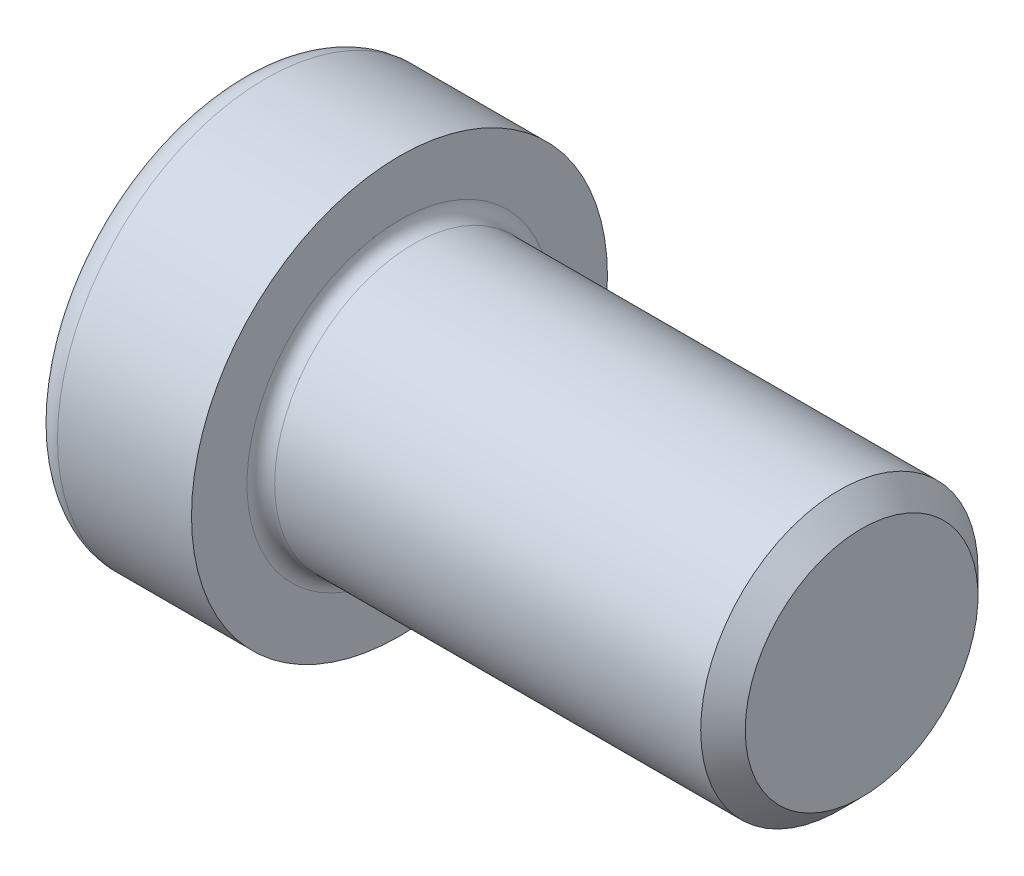
ISO-10303-21;
HEADER;
FILE_DESCRIPTION(('STEP AP214'),'2;1');
FILE_NAME('part.step','',(''),(''),'','','');
FILE_SCHEMA(('AUTOMOTIVE_DESIGN { 1 0 10303 214 1 1 1 1 }'));
ENDSEC;
DATA;
#1=APPLICATION_CONTEXT('core data for automotive mechanical design processes');
#2=APPLICATION_PROTOCOL_DEFINITION('international standard','automotive_design',2000,#1);
#3=PRODUCT_CONTEXT('',#1,'mechanical');
#4=PRODUCT('Part','Part','',(#3));
#5=PRODUCT_RELATED_PRODUCT_CATEGORY('part','',(#4));
#6=PRODUCT_DEFINITION_FORMATION('','',#4);
#7=PRODUCT_DEFINITION_CONTEXT('part definition',#1,'design');
#8=PRODUCT_DEFINITION('design','',#6,#7);
#9=PRODUCT_DEFINITION_SHAPE('','',#8);
#10=(LENGTH_UNIT() NAMED_UNIT(*) SI_UNIT(.MILLI.,.METRE.));
#11=(NAMED_UNIT(*) PLANE_ANGLE_UNIT() SI_UNIT($,.RADIAN.));
#12=(NAMED_UNIT(*) SI_UNIT($,.STERADIAN.) SOLID_ANGLE_UNIT());
#13=UNCERTAINTY_MEASURE_WITH_UNIT(LENGTH_MEASURE(1.E-05),#10,'distance_accuracy_value','');
#14=(GEOMETRIC_REPRESENTATION_CONTEXT(3) GLOBAL_UNCERTAINTY_ASSIGNED_CONTEXT((#13)) GLOBAL_UNIT_ASSIGNED_CONTEXT((#10,
#11,#12)) REPRESENTATION_CONTEXT('',''));
#15=CARTESIAN_POINT('',(0.,0.,0.));
#16=DIRECTION('',(0.,0.,1.));
#17=DIRECTION('',(1.,0.,0.));
#18=AXIS2_PLACEMENT_3D('',#15,#16,#17);
#19=CARTESIAN_POINT('',(0.,0.,0.));
#20=DIRECTION('',(-1.,0.,0.));
#21=DIRECTION('',(0.,0.,1.));
#22=AXIS2_PLACEMENT_3D('',#19,#20,#21);
#23=PLANE('',#22);
#24=DIRECTION('',(0.,-0.499999999999998,0.86602540378444));
#25=VECTOR('',#24,1.);
#26=CARTESIAN_POINT('',(0.,4.61880215351701,0.));
#27=LINE('',#26,#25);
#28=CARTESIAN_POINT('',(0.,4.61880215351701,0.));
#29=VERTEX_POINT('',#28);
#30=CARTESIAN_POINT('',(0.,2.30940107675852,3.99999999999999));
#31=VERTEX_POINT('',#30);
#32=EDGE_CURVE('E294',#29,#31,#27,.T.);
#33=ORIENTED_EDGE('',*,*,#32,.T.);
#34=DIRECTION('',(0.,1.,0.));
#35=VECTOR('',#34,1.);
#36=CARTESIAN_POINT('',(0.,-2.30940107675849,4.));
#37=LINE('',#36,#35);
#38=CARTESIAN_POINT('',(0.,-2.30940107675849,4.));
#39=VERTEX_POINT('',#38);
#40=EDGE_CURVE('E148',#39,#31,#37,.T.);
#41=ORIENTED_EDGE('',*,*,#40,.F.);
#42=DIRECTION('',(0.,-0.500000000000001,-0.866025403784438));
#43=VECTOR('',#42,1.);
#44=CARTESIAN_POINT('',(0.,-2.30940107675849,4.));
#45=LINE('',#44,#43);
#46=CARTESIAN_POINT('',(0.,-4.618802153517,0.));
#47=VERTEX_POINT('',#46);
#48=EDGE_CURVE('E299',#39,#47,#45,.T.);
#49=ORIENTED_EDGE('',*,*,#48,.T.);
#50=DIRECTION('',(0.,0.499999999999998,-0.86602540378444));
#51=VECTOR('',#50,1.);
#52=CARTESIAN_POINT('',(0.,-4.618802153517,0.));
#53=LINE('',#52,#51);
#54=CARTESIAN_POINT('',(0.,-2.3094010767585,-4.));
#55=VERTEX_POINT('',#54);
#56=EDGE_CURVE('E303',#47,#55,#53,.T.);
#57=ORIENTED_EDGE('',*,*,#56,.T.);
#58=DIRECTION('',(0.,-1.,0.));
#59=VECTOR('',#58,1.);
#60=CARTESIAN_POINT('',(0.,2.3094010767585,-4.00000000000001));
#61=LINE('',#60,#59);
#62=CARTESIAN_POINT('',(0.,2.3094010767585,-4.00000000000001));
#63=VERTEX_POINT('',#62);
#64=EDGE_CURVE('E307',#63,#55,#61,.T.);
#65=ORIENTED_EDGE('',*,*,#64,.F.);
#66=DIRECTION('',(0.,-0.500000000000001,-0.866025403784438));
#67=VECTOR('',#66,1.);
#68=CARTESIAN_POINT('',(0.,4.61880215351701,0.));
#69=LINE('',#68,#67);
#70=EDGE_CURVE('E143',#29,#63,#69,.T.);
#71=ORIENTED_EDGE('',*,*,#70,.F.);
#72=EDGE_LOOP('',(#33,#41,#49,#57,#65,#71));
#73=FACE_BOUND('',#72,.T.);
#74=CARTESIAN_POINT('',(0.,0.,0.));
#75=DIRECTION('',(-1.,0.,0.));
#76=DIRECTION('',(0.,0.,1.));
#77=AXIS2_PLACEMENT_3D('',#74,#75,#76);
#78=CIRCLE('',#77,7.8);
#79=CARTESIAN_POINT('',(0.,0.,7.8));
#80=VERTEX_POINT('',#79);
#81=EDGE_CURVE('E58',#80,#80,#78,.T.);
#82=ORIENTED_EDGE('',*,*,#81,.T.);
#83=EDGE_LOOP('',(#82));
#84=FACE_BOUND('',#83,.T.);
#85=ADVANCED_FACE('F49',(#73,#84),#23,.T.);
#86=CARTESIAN_POINT('',(-31.75,0.,0.));
#87=DIRECTION('',(-1.,0.,0.));
#88=DIRECTION('',(0.,0.,1.));
#89=AXIS2_PLACEMENT_3D('',#86,#87,#88);
#90=CYLINDRICAL_SURFACE('',#89,9.);
#91=CARTESIAN_POINT('',(1.2,0.,0.));
#92=DIRECTION('',(-1.,0.,0.));
#93=DIRECTION('',(0.,0.,1.));
#94=AXIS2_PLACEMENT_3D('',#91,#92,#93);
#95=CIRCLE('',#94,9.);
#96=CARTESIAN_POINT('',(1.2,0.,9.));
#97=VERTEX_POINT('',#96);
#98=EDGE_CURVE('E11',#97,#97,#95,.F.);
#99=ORIENTED_EDGE('',*,*,#98,.T.);
#100=EDGE_LOOP('',(#99));
#101=FACE_BOUND('',#100,.T.);
#102=CARTESIAN_POINT('',(7.,0.,0.));
#103=DIRECTION('',(-1.,0.,0.));
#104=DIRECTION('',(0.,0.,1.));
#105=AXIS2_PLACEMENT_3D('',#102,#103,#104);
#106=CIRCLE('',#105,9.);
#107=CARTESIAN_POINT('',(7.,0.,9.));
#108=VERTEX_POINT('',#107);
#109=EDGE_CURVE('E173',#108,#108,#106,.T.);
#110=ORIENTED_EDGE('',*,*,#109,.T.);
#111=EDGE_LOOP('',(#110));
#112=FACE_BOUND('',#111,.T.);
#113=ADVANCED_FACE('F203',(#101,#112),#90,.T.);
#114=CARTESIAN_POINT('',(7.,9.,0.));
#115=DIRECTION('',(1.,0.,0.));
#116=DIRECTION('',(0.,0.,-1.));
#117=AXIS2_PLACEMENT_3D('',#114,#115,#116);
#118=PLANE('',#117);
#119=CARTESIAN_POINT('',(7.,0.,0.));
#120=DIRECTION('',(1.,0.,0.));
#121=DIRECTION('',(0.,0.,-1.));
#122=AXIS2_PLACEMENT_3D('',#119,#120,#121);
#123=CIRCLE('',#122,6.6);
#124=CARTESIAN_POINT('',(7.,0.,-6.6));
#125=VERTEX_POINT('',#124);
#126=EDGE_CURVE('E177',#125,#125,#123,.F.);
#127=ORIENTED_EDGE('',*,*,#126,.T.);
#128=EDGE_LOOP('',(#127));
#129=FACE_BOUND('',#128,.T.);
#130=ORIENTED_EDGE('',*,*,#109,.F.);
#131=EDGE_LOOP('',(#130));
#132=FACE_BOUND('',#131,.T.);
#133=ADVANCED_FACE('F208',(#129,#132),#118,.T.);
#134=CARTESIAN_POINT('',(-31.75,0.,0.));
#135=DIRECTION('',(-1.,0.,0.));
#136=DIRECTION('',(0.,0.,1.));
#137=AXIS2_PLACEMENT_3D('',#134,#135,#136);
#138=CYLINDRICAL_SURFACE('',#137,6.);
#139=CARTESIAN_POINT('',(7.6,0.,0.));
#140=DIRECTION('',(1.,0.,0.));
#141=DIRECTION('',(0.,0.,-1.));
#142=AXIS2_PLACEMENT_3D('',#139,#140,#141);
#143=CIRCLE('',#142,6.);
#144=CARTESIAN_POINT('',(7.6,0.,-6.));
#145=VERTEX_POINT('',#144);
#146=EDGE_CURVE('E181',#145,#145,#143,.T.);
#147=ORIENTED_EDGE('',*,*,#146,.T.);
#148=EDGE_LOOP('',(#147));
#149=FACE_BOUND('',#148,.T.);
#150=CARTESIAN_POINT('',(26.036,0.,0.));
#151=DIRECTION('',(-1.,0.,0.));
#152=DIRECTION('',(0.,0.,1.));
#153=AXIS2_PLACEMENT_3D('',#150,#151,#152);
#154=CIRCLE('',#153,6.);
#155=CARTESIAN_POINT('',(26.036,0.,6.));
#156=VERTEX_POINT('',#155);
#157=EDGE_CURVE('E169',#156,#156,#154,.T.);
#158=ORIENTED_EDGE('',*,*,#157,.T.);
#159=EDGE_LOOP('',(#158));
#160=FACE_BOUND('',#159,.T.);
#161=ADVANCED_FACE('F214',(#149,#160),#138,.T.);
#162=CARTESIAN_POINT('',(27.,0.,0.));
#163=DIRECTION('',(-1.,0.,0.));
#164=DIRECTION('',(0.,0.,1.));
#165=AXIS2_PLACEMENT_3D('',#162,#163,#164);
#166=CONICAL_SURFACE('',#165,5.036,0.785398163397459);
#167=ORIENTED_EDGE('',*,*,#157,.F.);
#168=EDGE_LOOP('',(#167));
#169=FACE_BOUND('',#168,.T.);
#170=CARTESIAN_POINT('',(27.,0.,0.));
#171=DIRECTION('',(-1.,0.,0.));
#172=DIRECTION('',(0.,0.,1.));
#173=AXIS2_PLACEMENT_3D('',#170,#171,#172);
#174=CIRCLE('',#173,5.036);
#175=CARTESIAN_POINT('',(27.,0.,5.036));
#176=VERTEX_POINT('',#175);
#177=EDGE_CURVE('E164',#176,#176,#174,.T.);
#178=ORIENTED_EDGE('',*,*,#177,.T.);
#179=EDGE_LOOP('',(#178));
#180=FACE_BOUND('',#179,.T.);
#181=ADVANCED_FACE('F218',(#169,#180),#166,.T.);
#182=CARTESIAN_POINT('',(27.,5.036,0.));
#183=DIRECTION('',(1.,0.,0.));
#184=DIRECTION('',(0.,0.,-1.));
#185=AXIS2_PLACEMENT_3D('',#182,#183,#184);
#186=PLANE('',#185);
#187=ORIENTED_EDGE('',*,*,#177,.F.);
#188=EDGE_LOOP('',(#187));
#189=FACE_BOUND('',#188,.T.);
#190=ADVANCED_FACE('F200',(#189),#186,.T.);
#191=CARTESIAN_POINT('',(7.6,0.,0.));
#192=DIRECTION('',(1.,0.,0.));
#193=DIRECTION('',(0.,0.,-1.));
#194=AXIS2_PLACEMENT_3D('',#191,#192,#193);
#195=TOROIDAL_SURFACE('',#194,6.6,0.6);
#196=ORIENTED_EDGE('',*,*,#146,.F.);
#197=EDGE_LOOP('',(#196));
#198=FACE_BOUND('',#197,.T.);
#199=ORIENTED_EDGE('',*,*,#126,.F.);
#200=EDGE_LOOP('',(#199));
#201=FACE_BOUND('',#200,.T.);
#202=ADVANCED_FACE('F191',(#198,#201),#195,.F.);
#203=CARTESIAN_POINT('',(1.2,0.,0.));
#204=DIRECTION('',(-1.,0.,0.));
#205=DIRECTION('',(0.,0.,1.));
#206=AXIS2_PLACEMENT_3D('',#203,#204,#205);
#207=TOROIDAL_SURFACE('',#206,7.8,1.2);
#208=ORIENTED_EDGE('',*,*,#98,.F.);
#209=EDGE_LOOP('',(#208));
#210=FACE_BOUND('',#209,.T.);
#211=ORIENTED_EDGE('',*,*,#81,.F.);
#212=EDGE_LOOP('',(#211));
#213=FACE_BOUND('',#212,.T.);
#214=ADVANCED_FACE('F51',(#210,#213),#207,.T.);
#215=CARTESIAN_POINT('',(5.,4.61880215351701,0.));
#216=DIRECTION('',(0.,-0.86602540378444,-0.499999999999998));
#217=DIRECTION('',(0.,0.499999999999998,-0.86602540378444));
#218=AXIS2_PLACEMENT_3D('',#215,#216,#217);
#219=PLANE('',#218);
#220=ORIENTED_EDGE('',*,*,#32,.F.);
#221=DIRECTION('',(-1.,0.,0.));
#222=VECTOR('',#221,1.);
#223=CARTESIAN_POINT('',(5.,4.61880215351701,0.));
#224=LINE('',#223,#222);
#225=CARTESIAN_POINT('',(5.,4.61880215351701,0.));
#226=VERTEX_POINT('',#225);
#227=EDGE_CURVE('E280',#226,#29,#224,.T.);
#228=ORIENTED_EDGE('',*,*,#227,.F.);
#229=DIRECTION('',(0.,-0.499999999999998,0.86602540378444));
#230=VECTOR('',#229,1.);
#231=CARTESIAN_POINT('',(5.,4.61880215351701,0.));
#232=LINE('',#231,#230);
#233=CARTESIAN_POINT('',(5.,3.46410161513776,1.99999999999999));
#234=VERTEX_POINT('',#233);
#235=EDGE_CURVE('E134',#226,#234,#232,.T.);
#236=ORIENTED_EDGE('',*,*,#235,.T.);
#237=CARTESIAN_POINT('',(5.,2.30940107675852,3.99999999999999));
#238=VERTEX_POINT('',#237);
#239=EDGE_CURVE('E124',#234,#238,#232,.T.);
#240=ORIENTED_EDGE('',*,*,#239,.T.);
#241=DIRECTION('',(-1.,0.,0.));
#242=VECTOR('',#241,1.);
#243=CARTESIAN_POINT('',(5.,2.30940107675852,3.99999999999999));
#244=LINE('',#243,#242);
#245=EDGE_CURVE('E139',#238,#31,#244,.T.);
#246=ORIENTED_EDGE('',*,*,#245,.T.);
#247=EDGE_LOOP('',(#220,#228,#236,#240,#246));
#248=FACE_BOUND('',#247,.T.);
#249=ADVANCED_FACE('F138',(#248),#219,.T.);
#250=CARTESIAN_POINT('',(5.,-2.30940107675849,4.));
#251=DIRECTION('',(0.,0.,1.));
#252=DIRECTION('',(0.,-1.,0.));
#253=AXIS2_PLACEMENT_3D('',#250,#251,#252);
#254=PLANE('',#253);
#255=ORIENTED_EDGE('',*,*,#40,.T.);
#256=ORIENTED_EDGE('',*,*,#245,.F.);
#257=DIRECTION('',(0.,1.,0.));
#258=VECTOR('',#257,1.);
#259=CARTESIAN_POINT('',(5.,-2.30940107675849,4.));
#260=LINE('',#259,#258);
#261=CARTESIAN_POINT('',(5.,0.,3.99999999999999));
#262=VERTEX_POINT('',#261);
#263=EDGE_CURVE('E121',#262,#238,#260,.T.);
#264=ORIENTED_EDGE('',*,*,#263,.F.);
#265=CARTESIAN_POINT('',(5.,-2.30940107675849,4.));
#266=VERTEX_POINT('',#265);
#267=EDGE_CURVE('E133',#266,#262,#260,.T.);
#268=ORIENTED_EDGE('',*,*,#267,.F.);
#269=DIRECTION('',(-1.,0.,0.));
#270=VECTOR('',#269,1.);
#271=CARTESIAN_POINT('',(5.,-2.30940107675849,4.));
#272=LINE('',#271,#270);
#273=EDGE_CURVE('E151',#266,#39,#272,.T.);
#274=ORIENTED_EDGE('',*,*,#273,.T.);
#275=EDGE_LOOP('',(#255,#256,#264,#268,#274));
#276=FACE_BOUND('',#275,.T.);
#277=ADVANCED_FACE('F145',(#276),#254,.F.);
#278=CARTESIAN_POINT('',(5.,-2.30940107675849,4.));
#279=DIRECTION('',(0.,0.866025403784438,-0.500000000000001));
#280=DIRECTION('',(0.,0.500000000000001,0.866025403784438));
#281=AXIS2_PLACEMENT_3D('',#278,#279,#280);
#282=PLANE('',#281);
#283=ORIENTED_EDGE('',*,*,#48,.F.);
#284=ORIENTED_EDGE('',*,*,#273,.F.);
#285=DIRECTION('',(0.,-0.500000000000001,-0.866025403784438));
#286=VECTOR('',#285,1.);
#287=CARTESIAN_POINT('',(5.,-2.30940107675849,4.));
#288=LINE('',#287,#286);
#289=CARTESIAN_POINT('',(5.,-3.46410161513774,2.));
#290=VERTEX_POINT('',#289);
#291=EDGE_CURVE('E342',#266,#290,#288,.T.);
#292=ORIENTED_EDGE('',*,*,#291,.T.);
#293=CARTESIAN_POINT('',(5.,-4.618802153517,0.));
#294=VERTEX_POINT('',#293);
#295=EDGE_CURVE('E322',#290,#294,#288,.T.);
#296=ORIENTED_EDGE('',*,*,#295,.T.);
#297=DIRECTION('',(-1.,0.,0.));
#298=VECTOR('',#297,1.);
#299=CARTESIAN_POINT('',(5.,-4.618802153517,0.));
#300=LINE('',#299,#298);
#301=EDGE_CURVE('E159',#294,#47,#300,.T.);
#302=ORIENTED_EDGE('',*,*,#301,.T.);
#303=EDGE_LOOP('',(#283,#284,#292,#296,#302));
#304=FACE_BOUND('',#303,.T.);
#305=ADVANCED_FACE('F232',(#304),#282,.T.);
#306=CARTESIAN_POINT('',(5.,-4.618802153517,0.));
#307=DIRECTION('',(0.,0.86602540378444,0.499999999999998));
#308=DIRECTION('',(0.,-0.499999999999998,0.86602540378444));
#309=AXIS2_PLACEMENT_3D('',#306,#307,#308);
#310=PLANE('',#309);
#311=ORIENTED_EDGE('',*,*,#56,.F.);
#312=ORIENTED_EDGE('',*,*,#301,.F.);
#313=DIRECTION('',(0.,0.499999999999998,-0.86602540378444));
#314=VECTOR('',#313,1.);
#315=CARTESIAN_POINT('',(5.,-4.618802153517,0.));
#316=LINE('',#315,#314);
#317=CARTESIAN_POINT('',(5.,-3.46410161513776,-1.99999999999999));
#318=VERTEX_POINT('',#317);
#319=EDGE_CURVE('E289',#294,#318,#316,.T.);
#320=ORIENTED_EDGE('',*,*,#319,.T.);
#321=CARTESIAN_POINT('',(5.,-2.3094010767585,-4.));
#322=VERTEX_POINT('',#321);
#323=EDGE_CURVE('E340',#318,#322,#316,.T.);
#324=ORIENTED_EDGE('',*,*,#323,.T.);
#325=DIRECTION('',(-1.,0.,0.));
#326=VECTOR('',#325,1.);
#327=CARTESIAN_POINT('',(5.,-2.3094010767585,-4.));
#328=LINE('',#327,#326);
#329=EDGE_CURVE('E279',#322,#55,#328,.T.);
#330=ORIENTED_EDGE('',*,*,#329,.T.);
#331=EDGE_LOOP('',(#311,#312,#320,#324,#330));
#332=FACE_BOUND('',#331,.T.);
#333=ADVANCED_FACE('F235',(#332),#310,.T.);
#334=CARTESIAN_POINT('',(5.,2.3094010767585,-4.00000000000001));
#335=DIRECTION('',(0.,0.,-1.));
#336=DIRECTION('',(0.,1.,0.));
#337=AXIS2_PLACEMENT_3D('',#334,#335,#336);
#338=PLANE('',#337);
#339=ORIENTED_EDGE('',*,*,#64,.T.);
#340=ORIENTED_EDGE('',*,*,#329,.F.);
#341=DIRECTION('',(0.,-1.,0.));
#342=VECTOR('',#341,1.);
#343=CARTESIAN_POINT('',(5.,2.3094010767585,-4.00000000000001));
#344=LINE('',#343,#342);
#345=CARTESIAN_POINT('',(5.,0.,-4.));
#346=VERTEX_POINT('',#345);
#347=EDGE_CURVE('E283',#346,#322,#344,.T.);
#348=ORIENTED_EDGE('',*,*,#347,.F.);
#349=CARTESIAN_POINT('',(5.,2.3094010767585,-4.00000000000001));
#350=VERTEX_POINT('',#349);
#351=EDGE_CURVE('E65',#350,#346,#344,.T.);
#352=ORIENTED_EDGE('',*,*,#351,.F.);
#353=DIRECTION('',(-1.,0.,0.));
#354=VECTOR('',#353,1.);
#355=CARTESIAN_POINT('',(5.,2.3094010767585,-4.00000000000001));
#356=LINE('',#355,#354);
#357=EDGE_CURVE('E275',#350,#63,#356,.T.);
#358=ORIENTED_EDGE('',*,*,#357,.T.);
#359=EDGE_LOOP('',(#339,#340,#348,#352,#358));
#360=FACE_BOUND('',#359,.T.);
#361=ADVANCED_FACE('F239',(#360),#338,.F.);
#362=CARTESIAN_POINT('',(5.,4.61880215351701,0.));
#363=DIRECTION('',(0.,0.866025403784438,-0.500000000000001));
#364=DIRECTION('',(0.,0.500000000000001,0.866025403784438));
#365=AXIS2_PLACEMENT_3D('',#362,#363,#364);
#366=PLANE('',#365);
#367=ORIENTED_EDGE('',*,*,#70,.T.);
#368=ORIENTED_EDGE('',*,*,#357,.F.);
#369=DIRECTION('',(0.,-0.500000000000001,-0.866025403784438));
#370=VECTOR('',#369,1.);
#371=CARTESIAN_POINT('',(5.,4.61880215351701,0.));
#372=LINE('',#371,#370);
#373=CARTESIAN_POINT('',(5.,3.46410161513776,-2.00000000000001));
#374=VERTEX_POINT('',#373);
#375=EDGE_CURVE('E264',#374,#350,#372,.T.);
#376=ORIENTED_EDGE('',*,*,#375,.F.);
#377=EDGE_CURVE('E271',#226,#374,#372,.T.);
#378=ORIENTED_EDGE('',*,*,#377,.F.);
#379=ORIENTED_EDGE('',*,*,#227,.T.);
#380=EDGE_LOOP('',(#367,#368,#376,#378,#379));
#381=FACE_BOUND('',#380,.T.);
#382=ADVANCED_FACE('F243',(#381),#366,.F.);
#383=CARTESIAN_POINT('',(5.,6.9282032302755,-4.00000000000001));
#384=DIRECTION('',(1.,0.,0.));
#385=DIRECTION('',(0.,0.,-1.));
#386=AXIS2_PLACEMENT_3D('',#383,#384,#385);
#387=PLANE('',#386);
#388=ORIENTED_EDGE('',*,*,#347,.T.);
#389=ORIENTED_EDGE('',*,*,#323,.F.);
#390=CARTESIAN_POINT('',(5.,0.,0.));
#391=DIRECTION('',(-1.,0.,0.));
#392=DIRECTION('',(0.,0.,1.));
#393=AXIS2_PLACEMENT_3D('',#390,#391,#392);
#394=CIRCLE('',#393,4.);
#395=EDGE_CURVE('E331',#346,#318,#394,.T.);
#396=ORIENTED_EDGE('',*,*,#395,.F.);
#397=EDGE_LOOP('',(#388,#389,#396));
#398=FACE_BOUND('',#397,.T.);
#399=ADVANCED_FACE('F247',(#398),#387,.F.);
#400=ORIENTED_EDGE('',*,*,#319,.F.);
#401=ORIENTED_EDGE('',*,*,#295,.F.);
#402=EDGE_CURVE('E157',#318,#290,#394,.T.);
#403=ORIENTED_EDGE('',*,*,#402,.F.);
#404=EDGE_LOOP('',(#400,#401,#403));
#405=FACE_BOUND('',#404,.T.);
#406=ADVANCED_FACE('F250',(#405),#387,.F.);
#407=ORIENTED_EDGE('',*,*,#291,.F.);
#408=ORIENTED_EDGE('',*,*,#267,.T.);
#409=EDGE_CURVE('E150',#290,#262,#394,.T.);
#410=ORIENTED_EDGE('',*,*,#409,.F.);
#411=EDGE_LOOP('',(#407,#408,#410));
#412=FACE_BOUND('',#411,.T.);
#413=ADVANCED_FACE('F255',(#412),#387,.F.);
#414=ORIENTED_EDGE('',*,*,#263,.T.);
#415=ORIENTED_EDGE('',*,*,#239,.F.);
#416=EDGE_CURVE('E127',#262,#234,#394,.T.);
#417=ORIENTED_EDGE('',*,*,#416,.F.);
#418=EDGE_LOOP('',(#414,#415,#417));
#419=FACE_BOUND('',#418,.T.);
#420=ADVANCED_FACE('F123',(#419),#387,.F.);
#421=ORIENTED_EDGE('',*,*,#235,.F.);
#422=ORIENTED_EDGE('',*,*,#377,.T.);
#423=EDGE_CURVE('E165',#234,#374,#394,.T.);
#424=ORIENTED_EDGE('',*,*,#423,.F.);
#425=EDGE_LOOP('',(#421,#422,#424));
#426=FACE_BOUND('',#425,.T.);
#427=ADVANCED_FACE('F258',(#426),#387,.F.);
#428=ORIENTED_EDGE('',*,*,#375,.T.);
#429=ORIENTED_EDGE('',*,*,#351,.T.);
#430=EDGE_CURVE('E267',#374,#346,#394,.T.);
#431=ORIENTED_EDGE('',*,*,#430,.F.);
#432=EDGE_LOOP('',(#428,#429,#431));
#433=FACE_BOUND('',#432,.T.);
#434=ADVANCED_FACE('F228',(#433),#387,.F.);
#435=CARTESIAN_POINT('',(5.,0.,0.));
#436=DIRECTION('',(-1.,0.,0.));
#437=DIRECTION('',(0.,0.,1.));
#438=AXIS2_PLACEMENT_3D('',#435,#436,#437);
#439=CONICAL_SURFACE('',#438,4.,1.04719755119659);
#440=CARTESIAN_POINT('',(7.30940107675852,0.,0.));
#441=VERTEX_POINT('',#440);
#442=VERTEX_LOOP('',#441);
#443=FACE_BOUND('',#442,.T.);
#444=ORIENTED_EDGE('',*,*,#416,.T.);
#445=ORIENTED_EDGE('',*,*,#423,.T.);
#446=ORIENTED_EDGE('',*,*,#430,.T.);
#447=ORIENTED_EDGE('',*,*,#395,.T.);
#448=ORIENTED_EDGE('',*,*,#402,.T.);
#449=ORIENTED_EDGE('',*,*,#409,.T.);
#450=EDGE_LOOP('',(#444,#445,#446,#447,#448,#449));
#451=FACE_BOUND('',#450,.T.);
#452=ADVANCED_FACE('F226',(#443,#451),#439,.F.);
#453=CLOSED_SHELL('',(#85,#113,#133,#161,#181,#190,#202,#214,#249,#277,#305,#333,#361,#382,#399,
#406,#413,#420,#427,#434,#452));
#454=MANIFOLD_SOLID_BREP('B2',#453);
#455=ADVANCED_BREP_SHAPE_REPRESENTATION('',(#18,#454),#14);
#456=SHAPE_DEFINITION_REPRESENTATION(#9,#455);
ENDSEC;
END-ISO-10303-21;
